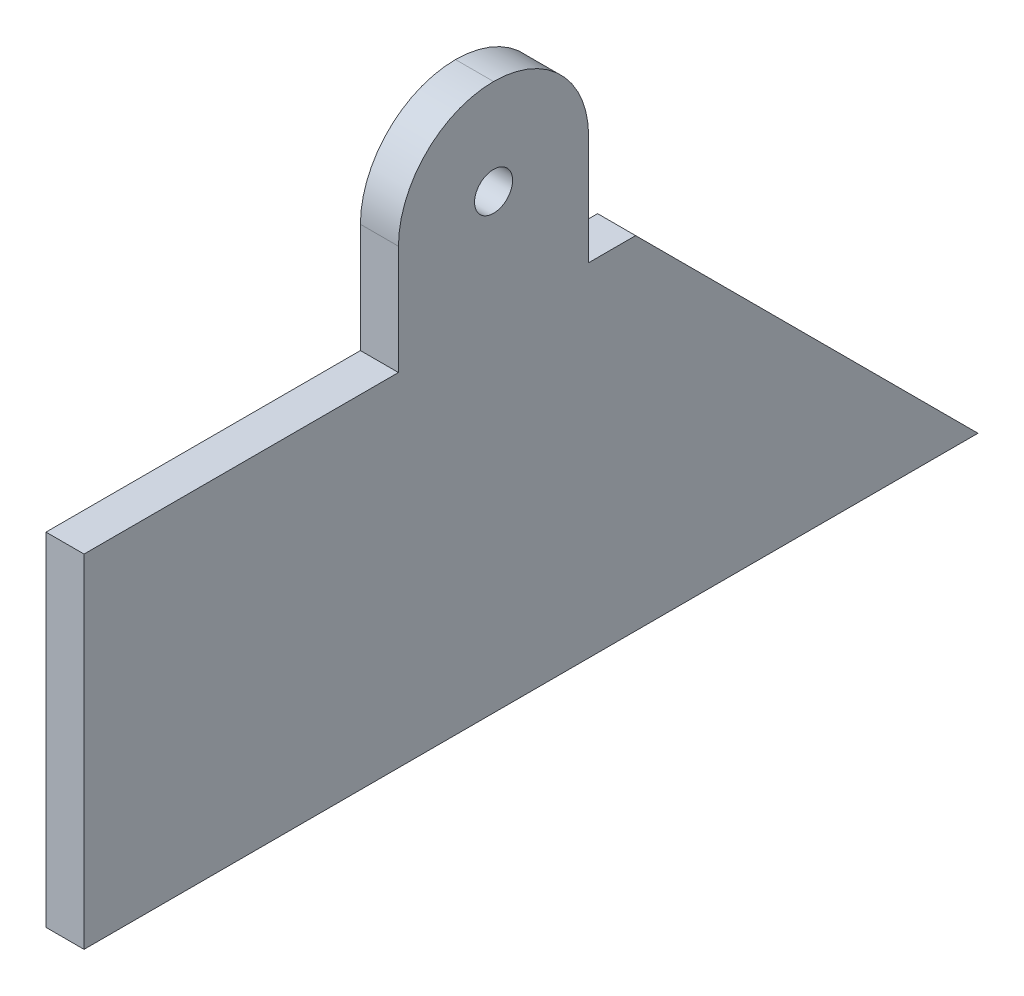
ISO-10303-21;
HEADER;
FILE_DESCRIPTION(('STEP AP214'),'2;1');
FILE_NAME('part.step','',(''),(''),'','','');
FILE_SCHEMA(('AUTOMOTIVE_DESIGN { 1 0 10303 214 1 1 1 1 }'));
ENDSEC;
DATA;
#1=APPLICATION_CONTEXT('core data for automotive mechanical design processes');
#2=APPLICATION_PROTOCOL_DEFINITION('international standard','automotive_design',2000,#1);
#3=PRODUCT_CONTEXT('',#1,'mechanical');
#4=PRODUCT('Part','Part','',(#3));
#5=PRODUCT_RELATED_PRODUCT_CATEGORY('part','',(#4));
#6=PRODUCT_DEFINITION_FORMATION('','',#4);
#7=PRODUCT_DEFINITION_CONTEXT('part definition',#1,'design');
#8=PRODUCT_DEFINITION('design','',#6,#7);
#9=PRODUCT_DEFINITION_SHAPE('','',#8);
#10=(LENGTH_UNIT() NAMED_UNIT(*) SI_UNIT(.MILLI.,.METRE.));
#11=(NAMED_UNIT(*) PLANE_ANGLE_UNIT() SI_UNIT($,.RADIAN.));
#12=(NAMED_UNIT(*) SI_UNIT($,.STERADIAN.) SOLID_ANGLE_UNIT());
#13=UNCERTAINTY_MEASURE_WITH_UNIT(LENGTH_MEASURE(1.E-05),#10,'distance_accuracy_value','');
#14=(GEOMETRIC_REPRESENTATION_CONTEXT(3) GLOBAL_UNCERTAINTY_ASSIGNED_CONTEXT((#13)) GLOBAL_UNIT_ASSIGNED_CONTEXT((#10,
#11,#12)) REPRESENTATION_CONTEXT('',''));
#15=CARTESIAN_POINT('',(0.,0.,0.));
#16=DIRECTION('',(0.,0.,1.));
#17=DIRECTION('',(1.,0.,0.));
#18=AXIS2_PLACEMENT_3D('',#15,#16,#17);
#19=CARTESIAN_POINT('',(0.,150.8125,-136.718039999999));
#20=DIRECTION('',(1.,0.,0.));
#21=DIRECTION('',(0.,0.,-1.));
#22=AXIS2_PLACEMENT_3D('',#19,#20,#21);
#23=CYLINDRICAL_SURFACE('',#22,31.75);
#24=DIRECTION('',(1.,0.,0.));
#25=VECTOR('',#24,1.);
#26=CARTESIAN_POINT('',(0.,182.5625,-136.718039999999));
#27=LINE('',#26,#25);
#28=CARTESIAN_POINT('',(12.7,182.5625,-136.718039999999));
#29=VERTEX_POINT('',#28);
#30=CARTESIAN_POINT('',(0.,182.5625,-136.718039999999));
#31=VERTEX_POINT('',#30);
#32=EDGE_CURVE('E200',#29,#31,#27,.F.);
#33=ORIENTED_EDGE('',*,*,#32,.T.);
#34=CARTESIAN_POINT('',(0.,150.8125,-136.718039999999));
#35=DIRECTION('',(1.,0.,0.));
#36=DIRECTION('',(0.,0.,-1.));
#37=AXIS2_PLACEMENT_3D('',#34,#35,#36);
#38=CIRCLE('',#37,31.75);
#39=CARTESIAN_POINT('',(0.,150.8125,-104.968039999999));
#40=VERTEX_POINT('',#39);
#41=EDGE_CURVE('E47',#40,#31,#38,.F.);
#42=ORIENTED_EDGE('',*,*,#41,.F.);
#43=DIRECTION('',(1.,0.,0.));
#44=VECTOR('',#43,1.);
#45=CARTESIAN_POINT('',(0.,150.8125,-104.968039999999));
#46=LINE('',#45,#44);
#47=CARTESIAN_POINT('',(12.7,150.8125,-104.968039999999));
#48=VERTEX_POINT('',#47);
#49=EDGE_CURVE('E208',#48,#40,#46,.F.);
#50=ORIENTED_EDGE('',*,*,#49,.F.);
#51=CARTESIAN_POINT('',(12.7,150.8125,-136.718039999999));
#52=DIRECTION('',(1.,0.,0.));
#53=DIRECTION('',(0.,0.,-1.));
#54=AXIS2_PLACEMENT_3D('',#51,#52,#53);
#55=CIRCLE('',#54,31.75);
#56=EDGE_CURVE('E11',#29,#48,#55,.T.);
#57=ORIENTED_EDGE('',*,*,#56,.F.);
#58=EDGE_LOOP('',(#33,#42,#50,#57));
#59=FACE_BOUND('',#58,.T.);
#60=ADVANCED_FACE('F39',(#59),#23,.T.);
#61=CARTESIAN_POINT('',(0.,150.8125,-136.718039999999));
#62=DIRECTION('',(1.,0.,0.));
#63=DIRECTION('',(0.,0.,-1.));
#64=AXIS2_PLACEMENT_3D('',#61,#62,#63);
#65=CYLINDRICAL_SURFACE('',#64,31.75);
#66=DIRECTION('',(1.,0.,0.));
#67=VECTOR('',#66,1.);
#68=CARTESIAN_POINT('',(0.,150.8125,-168.468039999999));
#69=LINE('',#68,#67);
#70=CARTESIAN_POINT('',(0.,150.8125,-168.468039999999));
#71=VERTEX_POINT('',#70);
#72=CARTESIAN_POINT('',(12.7,150.8125,-168.468039999999));
#73=VERTEX_POINT('',#72);
#74=EDGE_CURVE('E197',#71,#73,#69,.T.);
#75=ORIENTED_EDGE('',*,*,#74,.F.);
#76=CARTESIAN_POINT('',(0.,150.8125,-136.718039999999));
#77=DIRECTION('',(1.,0.,0.));
#78=DIRECTION('',(0.,0.,-1.));
#79=AXIS2_PLACEMENT_3D('',#76,#77,#78);
#80=CIRCLE('',#79,31.75);
#81=EDGE_CURVE('E113',#31,#71,#80,.F.);
#82=ORIENTED_EDGE('',*,*,#81,.F.);
#83=ORIENTED_EDGE('',*,*,#32,.F.);
#84=CARTESIAN_POINT('',(12.7,150.8125,-136.718039999999));
#85=DIRECTION('',(1.,0.,0.));
#86=DIRECTION('',(0.,0.,-1.));
#87=AXIS2_PLACEMENT_3D('',#84,#85,#86);
#88=CIRCLE('',#87,31.75);
#89=EDGE_CURVE('E205',#73,#29,#88,.T.);
#90=ORIENTED_EDGE('',*,*,#89,.F.);
#91=EDGE_LOOP('',(#75,#82,#83,#90));
#92=FACE_BOUND('',#91,.T.);
#93=ADVANCED_FACE('F213',(#92),#65,.T.);
#94=CARTESIAN_POINT('',(12.7,114.3,0.));
#95=DIRECTION('',(0.,1.,0.));
#96=DIRECTION('',(0.,0.,1.));
#97=AXIS2_PLACEMENT_3D('',#94,#95,#96);
#98=PLANE('',#97);
#99=DIRECTION('',(1.,0.,0.));
#100=VECTOR('',#99,1.);
#101=CARTESIAN_POINT('',(0.,114.3,-104.968039999999));
#102=LINE('',#101,#100);
#103=CARTESIAN_POINT('',(0.,114.3,-104.968039999999));
#104=VERTEX_POINT('',#103);
#105=CARTESIAN_POINT('',(12.7,114.3,-104.968039999999));
#106=VERTEX_POINT('',#105);
#107=EDGE_CURVE('E137',#104,#106,#102,.T.);
#108=ORIENTED_EDGE('',*,*,#107,.F.);
#109=DIRECTION('',(0.,0.,-1.));
#110=VECTOR('',#109,1.);
#111=CARTESIAN_POINT('',(0.,114.3,0.));
#112=LINE('',#111,#110);
#113=CARTESIAN_POINT('',(0.,114.3,0.));
#114=VERTEX_POINT('',#113);
#115=EDGE_CURVE('E131',#114,#104,#112,.T.);
#116=ORIENTED_EDGE('',*,*,#115,.F.);
#117=DIRECTION('',(-1.,0.,0.));
#118=VECTOR('',#117,1.);
#119=CARTESIAN_POINT('',(12.7,114.3,0.));
#120=LINE('',#119,#118);
#121=CARTESIAN_POINT('',(12.7,114.3,0.));
#122=VERTEX_POINT('',#121);
#123=EDGE_CURVE('E188',#122,#114,#120,.T.);
#124=ORIENTED_EDGE('',*,*,#123,.F.);
#125=DIRECTION('',(0.,0.,-1.));
#126=VECTOR('',#125,1.);
#127=CARTESIAN_POINT('',(12.7,114.3,0.));
#128=LINE('',#127,#126);
#129=EDGE_CURVE('E167',#122,#106,#128,.T.);
#130=ORIENTED_EDGE('',*,*,#129,.T.);
#131=EDGE_LOOP('',(#108,#116,#124,#130));
#132=FACE_BOUND('',#131,.T.);
#133=ADVANCED_FACE('F231',(#132),#98,.T.);
#134=CARTESIAN_POINT('',(12.7,0.,0.));
#135=DIRECTION('',(0.,1.,0.));
#136=DIRECTION('',(0.,0.,1.));
#137=AXIS2_PLACEMENT_3D('',#134,#135,#136);
#138=PLANE('',#137);
#139=DIRECTION('',(0.,0.,-1.));
#140=VECTOR('',#139,1.);
#141=CARTESIAN_POINT('',(0.,0.,0.));
#142=LINE('',#141,#140);
#143=CARTESIAN_POINT('',(0.,0.,0.));
#144=VERTEX_POINT('',#143);
#145=CARTESIAN_POINT('',(0.,0.,-298.45));
#146=VERTEX_POINT('',#145);
#147=EDGE_CURVE('E156',#144,#146,#142,.T.);
#148=ORIENTED_EDGE('',*,*,#147,.T.);
#149=DIRECTION('',(-1.,0.,0.));
#150=VECTOR('',#149,1.);
#151=CARTESIAN_POINT('',(12.7,0.,-298.45));
#152=LINE('',#151,#150);
#153=CARTESIAN_POINT('',(12.7,0.,-298.45));
#154=VERTEX_POINT('',#153);
#155=EDGE_CURVE('E193',#154,#146,#152,.T.);
#156=ORIENTED_EDGE('',*,*,#155,.F.);
#157=DIRECTION('',(0.,0.,-1.));
#158=VECTOR('',#157,1.);
#159=CARTESIAN_POINT('',(12.7,0.,0.));
#160=LINE('',#159,#158);
#161=CARTESIAN_POINT('',(12.7,0.,0.));
#162=VERTEX_POINT('',#161);
#163=EDGE_CURVE('E157',#162,#154,#160,.T.);
#164=ORIENTED_EDGE('',*,*,#163,.F.);
#165=DIRECTION('',(-1.,0.,0.));
#166=VECTOR('',#165,1.);
#167=CARTESIAN_POINT('',(12.7,0.,0.));
#168=LINE('',#167,#166);
#169=EDGE_CURVE('E175',#162,#144,#168,.T.);
#170=ORIENTED_EDGE('',*,*,#169,.T.);
#171=EDGE_LOOP('',(#148,#156,#164,#170));
#172=FACE_BOUND('',#171,.T.);
#173=ADVANCED_FACE('F253',(#172),#138,.F.);
#174=CARTESIAN_POINT('',(12.7,0.,-298.45));
#175=DIRECTION('',(0.,-0.707106781186551,0.707106781186544));
#176=DIRECTION('',(0.,-0.707106781186544,-0.707106781186551));
#177=AXIS2_PLACEMENT_3D('',#174,#175,#176);
#178=PLANE('',#177);
#179=DIRECTION('',(0.,0.707106781186544,0.707106781186551));
#180=VECTOR('',#179,1.);
#181=CARTESIAN_POINT('',(0.,0.,-298.45));
#182=LINE('',#181,#180);
#183=CARTESIAN_POINT('',(0.,114.3,-184.149999999999));
#184=VERTEX_POINT('',#183);
#185=EDGE_CURVE('E132',#146,#184,#182,.T.);
#186=ORIENTED_EDGE('',*,*,#185,.T.);
#187=DIRECTION('',(-1.,0.,0.));
#188=VECTOR('',#187,1.);
#189=CARTESIAN_POINT('',(12.7,114.3,-184.149999999999));
#190=LINE('',#189,#188);
#191=CARTESIAN_POINT('',(12.7,114.3,-184.149999999999));
#192=VERTEX_POINT('',#191);
#193=EDGE_CURVE('E128',#192,#184,#190,.T.);
#194=ORIENTED_EDGE('',*,*,#193,.F.);
#195=DIRECTION('',(0.,0.707106781186544,0.707106781186551));
#196=VECTOR('',#195,1.);
#197=CARTESIAN_POINT('',(12.7,0.,-298.45));
#198=LINE('',#197,#196);
#199=EDGE_CURVE('E161',#154,#192,#198,.T.);
#200=ORIENTED_EDGE('',*,*,#199,.F.);
#201=ORIENTED_EDGE('',*,*,#155,.T.);
#202=EDGE_LOOP('',(#186,#194,#200,#201));
#203=FACE_BOUND('',#202,.T.);
#204=ADVANCED_FACE('F221',(#203),#178,.F.);
#205=DIRECTION('',(-1.,0.,0.));
#206=VECTOR('',#205,1.);
#207=CARTESIAN_POINT('',(0.,114.3,-168.468039999999));
#208=LINE('',#207,#206);
#209=CARTESIAN_POINT('',(12.7,114.3,-168.468039999999));
#210=VERTEX_POINT('',#209);
#211=CARTESIAN_POINT('',(0.,114.3,-168.468039999999));
#212=VERTEX_POINT('',#211);
#213=EDGE_CURVE('E125',#210,#212,#208,.T.);
#214=ORIENTED_EDGE('',*,*,#213,.F.);
#215=EDGE_CURVE('E166',#210,#192,#128,.T.);
#216=ORIENTED_EDGE('',*,*,#215,.T.);
#217=ORIENTED_EDGE('',*,*,#193,.T.);
#218=EDGE_CURVE('E110',#212,#184,#112,.T.);
#219=ORIENTED_EDGE('',*,*,#218,.F.);
#220=EDGE_LOOP('',(#214,#216,#217,#219));
#221=FACE_BOUND('',#220,.T.);
#222=ADVANCED_FACE('F124',(#221),#98,.T.);
#223=CARTESIAN_POINT('',(12.7,0.,0.));
#224=DIRECTION('',(0.,0.,1.));
#225=DIRECTION('',(1.,0.,0.));
#226=AXIS2_PLACEMENT_3D('',#223,#224,#225);
#227=PLANE('',#226);
#228=DIRECTION('',(0.,1.,0.));
#229=VECTOR('',#228,1.);
#230=CARTESIAN_POINT('',(0.,0.,0.));
#231=LINE('',#230,#229);
#232=EDGE_CURVE('E162',#144,#114,#231,.T.);
#233=ORIENTED_EDGE('',*,*,#232,.F.);
#234=ORIENTED_EDGE('',*,*,#169,.F.);
#235=DIRECTION('',(0.,1.,0.));
#236=VECTOR('',#235,1.);
#237=CARTESIAN_POINT('',(12.7,0.,0.));
#238=LINE('',#237,#236);
#239=EDGE_CURVE('E171',#162,#122,#238,.T.);
#240=ORIENTED_EDGE('',*,*,#239,.T.);
#241=ORIENTED_EDGE('',*,*,#123,.T.);
#242=EDGE_LOOP('',(#233,#234,#240,#241));
#243=FACE_BOUND('',#242,.T.);
#244=ADVANCED_FACE('F226',(#243),#227,.T.);
#245=CARTESIAN_POINT('',(12.7,0.,0.));
#246=DIRECTION('',(1.,0.,0.));
#247=DIRECTION('',(0.,0.,-1.));
#248=AXIS2_PLACEMENT_3D('',#245,#246,#247);
#249=PLANE('',#248);
#250=CARTESIAN_POINT('',(12.7,150.8125,-136.718039999999));
#251=DIRECTION('',(1.,0.,0.));
#252=DIRECTION('',(0.,0.,-1.));
#253=AXIS2_PLACEMENT_3D('',#250,#251,#252);
#254=CIRCLE('',#253,6.34999999999999);
#255=CARTESIAN_POINT('',(12.7,150.8125,-143.068039999999));
#256=VERTEX_POINT('',#255);
#257=EDGE_CURVE('E146',#256,#256,#254,.T.);
#258=ORIENTED_EDGE('',*,*,#257,.F.);
#259=EDGE_LOOP('',(#258));
#260=FACE_BOUND('',#259,.T.);
#261=ORIENTED_EDGE('',*,*,#89,.T.);
#262=ORIENTED_EDGE('',*,*,#56,.T.);
#263=DIRECTION('',(0.,-1.,0.));
#264=VECTOR('',#263,1.);
#265=CARTESIAN_POINT('',(12.7,182.5625,-104.968039999999));
#266=LINE('',#265,#264);
#267=EDGE_CURVE('E143',#48,#106,#266,.T.);
#268=ORIENTED_EDGE('',*,*,#267,.T.);
#269=ORIENTED_EDGE('',*,*,#129,.F.);
#270=ORIENTED_EDGE('',*,*,#239,.F.);
#271=ORIENTED_EDGE('',*,*,#163,.T.);
#272=ORIENTED_EDGE('',*,*,#199,.T.);
#273=ORIENTED_EDGE('',*,*,#215,.F.);
#274=DIRECTION('',(0.,-1.,0.));
#275=VECTOR('',#274,1.);
#276=CARTESIAN_POINT('',(12.7,182.5625,-168.468039999999));
#277=LINE('',#276,#275);
#278=EDGE_CURVE('E119',#73,#210,#277,.T.);
#279=ORIENTED_EDGE('',*,*,#278,.F.);
#280=EDGE_LOOP('',(#261,#262,#268,#269,#270,#271,#272,#273,#279));
#281=FACE_BOUND('',#280,.T.);
#282=ADVANCED_FACE('F215',(#260,#281),#249,.T.);
#283=CARTESIAN_POINT('',(0.,0.,0.));
#284=DIRECTION('',(1.,0.,0.));
#285=DIRECTION('',(0.,0.,-1.));
#286=AXIS2_PLACEMENT_3D('',#283,#284,#285);
#287=PLANE('',#286);
#288=CARTESIAN_POINT('',(0.,150.8125,-136.718039999999));
#289=DIRECTION('',(1.,0.,0.));
#290=DIRECTION('',(0.,0.,-1.));
#291=AXIS2_PLACEMENT_3D('',#288,#289,#290);
#292=CIRCLE('',#291,6.34999999999999);
#293=CARTESIAN_POINT('',(0.,150.8125,-143.068039999999));
#294=VERTEX_POINT('',#293);
#295=EDGE_CURVE('E138',#294,#294,#292,.F.);
#296=ORIENTED_EDGE('',*,*,#295,.F.);
#297=EDGE_LOOP('',(#296));
#298=FACE_BOUND('',#297,.T.);
#299=DIRECTION('',(0.,-1.,0.));
#300=VECTOR('',#299,1.);
#301=CARTESIAN_POINT('',(0.,182.5625,-104.968039999999));
#302=LINE('',#301,#300);
#303=EDGE_CURVE('E120',#40,#104,#302,.T.);
#304=ORIENTED_EDGE('',*,*,#303,.F.);
#305=ORIENTED_EDGE('',*,*,#41,.T.);
#306=ORIENTED_EDGE('',*,*,#81,.T.);
#307=DIRECTION('',(0.,-1.,0.));
#308=VECTOR('',#307,1.);
#309=CARTESIAN_POINT('',(0.,182.5625,-168.468039999999));
#310=LINE('',#309,#308);
#311=EDGE_CURVE('E106',#71,#212,#310,.T.);
#312=ORIENTED_EDGE('',*,*,#311,.T.);
#313=ORIENTED_EDGE('',*,*,#218,.T.);
#314=ORIENTED_EDGE('',*,*,#185,.F.);
#315=ORIENTED_EDGE('',*,*,#147,.F.);
#316=ORIENTED_EDGE('',*,*,#232,.T.);
#317=ORIENTED_EDGE('',*,*,#115,.T.);
#318=EDGE_LOOP('',(#304,#305,#306,#312,#313,#314,#315,#316,#317));
#319=FACE_BOUND('',#318,.T.);
#320=ADVANCED_FACE('F109',(#298,#319),#287,.F.);
#321=CARTESIAN_POINT('',(0.,182.5625,-168.468039999999));
#322=DIRECTION('',(0.,0.,1.));
#323=DIRECTION('',(1.,0.,0.));
#324=AXIS2_PLACEMENT_3D('',#321,#322,#323);
#325=PLANE('',#324);
#326=ORIENTED_EDGE('',*,*,#311,.F.);
#327=ORIENTED_EDGE('',*,*,#74,.T.);
#328=ORIENTED_EDGE('',*,*,#278,.T.);
#329=ORIENTED_EDGE('',*,*,#213,.T.);
#330=EDGE_LOOP('',(#326,#327,#328,#329));
#331=FACE_BOUND('',#330,.T.);
#332=ADVANCED_FACE('F134',(#331),#325,.F.);
#333=CARTESIAN_POINT('',(0.,182.5625,-104.968039999999));
#334=DIRECTION('',(0.,0.,-1.));
#335=DIRECTION('',(-1.,0.,0.));
#336=AXIS2_PLACEMENT_3D('',#333,#334,#335);
#337=PLANE('',#336);
#338=ORIENTED_EDGE('',*,*,#267,.F.);
#339=ORIENTED_EDGE('',*,*,#49,.T.);
#340=ORIENTED_EDGE('',*,*,#303,.T.);
#341=ORIENTED_EDGE('',*,*,#107,.T.);
#342=EDGE_LOOP('',(#338,#339,#340,#341));
#343=FACE_BOUND('',#342,.T.);
#344=ADVANCED_FACE('F233',(#343),#337,.F.);
#345=CARTESIAN_POINT('',(-17.9605122421383,150.8125,-136.718039999999));
#346=DIRECTION('',(1.,0.,0.));
#347=DIRECTION('',(0.,0.,-1.));
#348=AXIS2_PLACEMENT_3D('',#345,#346,#347);
#349=CYLINDRICAL_SURFACE('',#348,6.34999999999999);
#350=CARTESIAN_POINT('',(0.,150.8125,-143.068039999999));
#351=CARTESIAN_POINT('',(0.132291666666664,150.8125,-143.068039999999));
#352=CARTESIAN_POINT('',(0.264583333333331,150.8125,-143.068039999999));
#353=CARTESIAN_POINT('',(0.529166666666664,150.8125,-143.068039999999));
#354=CARTESIAN_POINT('',(0.66145833333333,150.8125,-143.068039999999));
#355=CARTESIAN_POINT('',(0.926041666666663,150.8125,-143.068039999999));
#356=CARTESIAN_POINT('',(1.05833333333333,150.8125,-143.068039999999));
#357=CARTESIAN_POINT('',(1.32291666666666,150.8125,-143.068039999999));
#358=CARTESIAN_POINT('',(1.45520833333333,150.8125,-143.068039999999));
#359=CARTESIAN_POINT('',(1.71979166666666,150.8125,-143.068039999999));
#360=CARTESIAN_POINT('',(1.85208333333333,150.8125,-143.068039999999));
#361=CARTESIAN_POINT('',(2.11666666666666,150.8125,-143.068039999999));
#362=CARTESIAN_POINT('',(2.24895833333333,150.8125,-143.068039999999));
#363=CARTESIAN_POINT('',(2.51354166666666,150.8125,-143.068039999999));
#364=CARTESIAN_POINT('',(2.64583333333333,150.8125,-143.068039999999));
#365=CARTESIAN_POINT('',(2.91041666666666,150.8125,-143.068039999999));
#366=CARTESIAN_POINT('',(3.04270833333333,150.8125,-143.068039999999));
#367=CARTESIAN_POINT('',(3.30729166666666,150.8125,-143.068039999999));
#368=CARTESIAN_POINT('',(3.43958333333333,150.8125,-143.068039999999));
#369=CARTESIAN_POINT('',(3.70416666666666,150.8125,-143.068039999999));
#370=CARTESIAN_POINT('',(3.83645833333333,150.8125,-143.068039999999));
#371=CARTESIAN_POINT('',(4.10104166666666,150.8125,-143.068039999999));
#372=CARTESIAN_POINT('',(4.23333333333333,150.8125,-143.068039999999));
#373=CARTESIAN_POINT('',(4.49791666666667,150.8125,-143.068039999999));
#374=CARTESIAN_POINT('',(4.63020833333333,150.8125,-143.068039999999));
#375=CARTESIAN_POINT('',(4.89479166666667,150.8125,-143.068039999999));
#376=CARTESIAN_POINT('',(5.02708333333333,150.8125,-143.068039999999));
#377=CARTESIAN_POINT('',(5.29166666666666,150.8125,-143.068039999999));
#378=CARTESIAN_POINT('',(5.42395833333333,150.8125,-143.068039999999));
#379=CARTESIAN_POINT('',(5.68854166666667,150.8125,-143.068039999999));
#380=CARTESIAN_POINT('',(5.82083333333333,150.8125,-143.068039999999));
#381=CARTESIAN_POINT('',(6.08541666666667,150.8125,-143.068039999999));
#382=CARTESIAN_POINT('',(6.21770833333333,150.8125,-143.068039999999));
#383=CARTESIAN_POINT('',(6.48229166666666,150.8125,-143.068039999999));
#384=CARTESIAN_POINT('',(6.61458333333333,150.8125,-143.068039999999));
#385=CARTESIAN_POINT('',(6.87916666666666,150.8125,-143.068039999999));
#386=CARTESIAN_POINT('',(7.01145833333333,150.8125,-143.068039999999));
#387=CARTESIAN_POINT('',(7.27604166666666,150.8125,-143.068039999999));
#388=CARTESIAN_POINT('',(7.40833333333333,150.8125,-143.068039999999));
#389=CARTESIAN_POINT('',(7.67291666666666,150.8125,-143.068039999999));
#390=CARTESIAN_POINT('',(7.80520833333333,150.8125,-143.068039999999));
#391=CARTESIAN_POINT('',(8.06979166666666,150.8125,-143.068039999999));
#392=CARTESIAN_POINT('',(8.20208333333333,150.8125,-143.068039999999));
#393=CARTESIAN_POINT('',(8.46666666666667,150.8125,-143.068039999999));
#394=CARTESIAN_POINT('',(8.59895833333333,150.8125,-143.068039999999));
#395=CARTESIAN_POINT('',(8.86354166666666,150.8125,-143.068039999999));
#396=CARTESIAN_POINT('',(8.99583333333333,150.8125,-143.068039999999));
#397=CARTESIAN_POINT('',(9.26041666666666,150.8125,-143.068039999999));
#398=CARTESIAN_POINT('',(9.39270833333333,150.8125,-143.068039999999));
#399=CARTESIAN_POINT('',(9.65729166666667,150.8125,-143.068039999999));
#400=CARTESIAN_POINT('',(9.78958333333333,150.8125,-143.068039999999));
#401=CARTESIAN_POINT('',(10.0541666666667,150.8125,-143.068039999999));
#402=CARTESIAN_POINT('',(10.1864583333333,150.8125,-143.068039999999));
#403=CARTESIAN_POINT('',(10.4510416666667,150.8125,-143.068039999999));
#404=CARTESIAN_POINT('',(10.5833333333333,150.8125,-143.068039999999));
#405=CARTESIAN_POINT('',(10.8479166666667,150.8125,-143.068039999999));
#406=CARTESIAN_POINT('',(10.9802083333333,150.8125,-143.068039999999));
#407=CARTESIAN_POINT('',(11.2447916666667,150.8125,-143.068039999999));
#408=CARTESIAN_POINT('',(11.3770833333333,150.8125,-143.068039999999));
#409=CARTESIAN_POINT('',(11.6416666666667,150.8125,-143.068039999999));
#410=CARTESIAN_POINT('',(11.7739583333333,150.8125,-143.068039999999));
#411=CARTESIAN_POINT('',(12.0385416666667,150.8125,-143.068039999999));
#412=CARTESIAN_POINT('',(12.1708333333333,150.8125,-143.068039999999));
#413=CARTESIAN_POINT('',(12.4354166666667,150.8125,-143.068039999999));
#414=CARTESIAN_POINT('',(12.5677083333333,150.8125,-143.068039999999));
#415=CARTESIAN_POINT('',(12.7,150.8125,-143.068039999999));
#416=B_SPLINE_CURVE_WITH_KNOTS('',3,(#350,#351,#352,#353,#354,#355,#356,#357,#358,#359,#360,
#361,#362,#363,#364,#365,#366,#367,#368,#369,#370,#371,#372,#373,#374,#375,#376,#377,#378,#379,
#380,#381,#382,#383,#384,#385,#386,#387,#388,#389,#390,#391,#392,#393,#394,#395,#396,#397,#398,
#399,#400,#401,#402,#403,#404,#405,#406,#407,#408,#409,#410,#411,#412,#413,#414,#415),
.UNSPECIFIED.,.F.,.F.,(4,2,2,2,2,2,2,2,2,2,2,2,2,2,2,2,2,2,2,2,2,2,2,2,2,2,2,2,2,2,2,2,4),(0.,
0.396875000000001,0.793749999999999,1.190625,1.5875,1.984375,2.38125,2.778125,3.175,3.571875,
3.96875,4.365625,4.7625,5.159375,5.55625,5.953125,6.35,6.746875,7.14375,7.540625,7.9375,
8.334375,8.73125,9.128125,9.525,9.921875,10.31875,10.715625,11.1125,11.509375,11.90625,
12.303125,12.7),.UNSPECIFIED.);
#417=EDGE_CURVE('BSEAM235',#294,#256,#416,.T.);
#418=ORIENTED_EDGE('',*,*,#295,.T.);
#419=ORIENTED_EDGE('',*,*,#257,.T.);
#420=ORIENTED_EDGE('',*,*,#417,.T.);
#421=ORIENTED_EDGE('',*,*,#417,.F.);
#422=EDGE_LOOP('',(#418,#420,#419,#421));
#423=FACE_BOUND('',#422,.T.);
#424=ADVANCED_FACE('F235',(#423),#349,.F.);
#425=CLOSED_SHELL('',(#60,#93,#133,#173,#204,#222,#244,#282,#320,#332,#344,#424));
#426=MANIFOLD_SOLID_BREP('B2',#425);
#427=ADVANCED_BREP_SHAPE_REPRESENTATION('',(#18,#426),#14);
#428=SHAPE_DEFINITION_REPRESENTATION(#9,#427);
ENDSEC;
END-ISO-10303-21;
